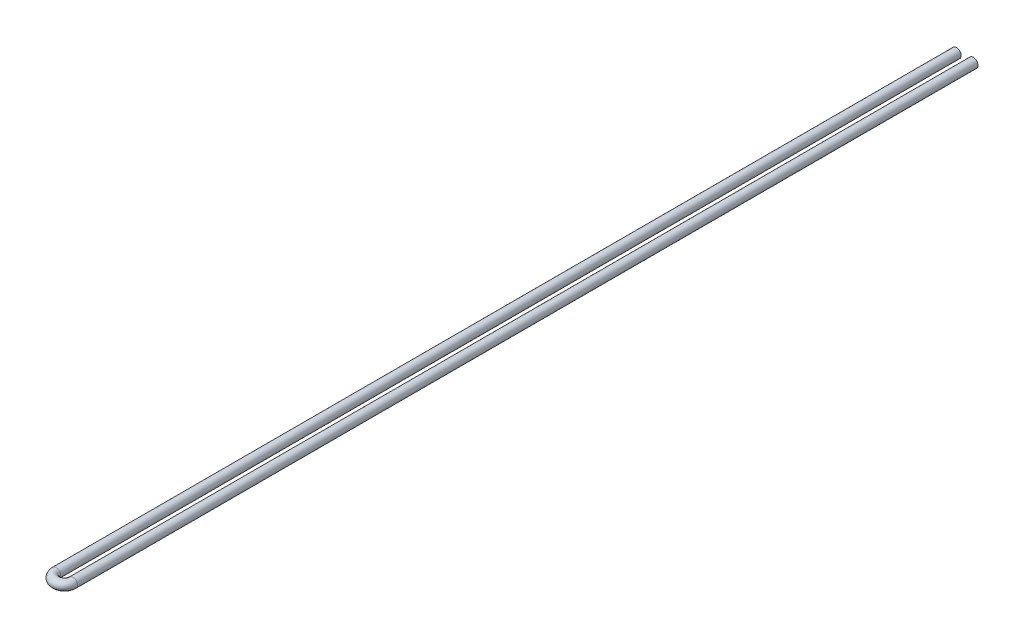
ISO-10303-21;
HEADER;
FILE_DESCRIPTION(('STEP AP214'),'2;1');
FILE_NAME('part.step','',(''),(''),'','','');
FILE_SCHEMA(('AUTOMOTIVE_DESIGN { 1 0 10303 214 1 1 1 1 }'));
ENDSEC;
DATA;
#1=APPLICATION_CONTEXT('core data for automotive mechanical design processes');
#2=APPLICATION_PROTOCOL_DEFINITION('international standard','automotive_design',2000,#1);
#3=PRODUCT_CONTEXT('',#1,'mechanical');
#4=PRODUCT('Part','Part','',(#3));
#5=PRODUCT_RELATED_PRODUCT_CATEGORY('part','',(#4));
#6=PRODUCT_DEFINITION_FORMATION('','',#4);
#7=PRODUCT_DEFINITION_CONTEXT('part definition',#1,'design');
#8=PRODUCT_DEFINITION('design','',#6,#7);
#9=PRODUCT_DEFINITION_SHAPE('','',#8);
#10=(LENGTH_UNIT() NAMED_UNIT(*) SI_UNIT(.MILLI.,.METRE.));
#11=(NAMED_UNIT(*) PLANE_ANGLE_UNIT() SI_UNIT($,.RADIAN.));
#12=(NAMED_UNIT(*) SI_UNIT($,.STERADIAN.) SOLID_ANGLE_UNIT());
#13=UNCERTAINTY_MEASURE_WITH_UNIT(LENGTH_MEASURE(1.E-05),#10,'distance_accuracy_value','');
#14=(GEOMETRIC_REPRESENTATION_CONTEXT(3) GLOBAL_UNCERTAINTY_ASSIGNED_CONTEXT((#13)) GLOBAL_UNIT_ASSIGNED_CONTEXT((#10,
#11,#12)) REPRESENTATION_CONTEXT('',''));
#15=CARTESIAN_POINT('',(0.,0.,0.));
#16=DIRECTION('',(0.,0.,1.));
#17=DIRECTION('',(1.,0.,0.));
#18=AXIS2_PLACEMENT_3D('',#15,#16,#17);
#19=CARTESIAN_POINT('',(-40.,0.,299.999999999999));
#20=DIRECTION('',(0.,0.,1.));
#21=DIRECTION('',(1.,0.,0.));
#22=AXIS2_PLACEMENT_3D('',#19,#20,#21);
#23=CYLINDRICAL_SURFACE('',#22,11.1);
#24=CARTESIAN_POINT('',(-39.9999999999997,0.,2440.));
#25=DIRECTION('',(0.,0.,1.));
#26=DIRECTION('',(1.,0.,0.));
#27=AXIS2_PLACEMENT_3D('',#24,#25,#26);
#28=CIRCLE('',#27,11.1);
#29=CARTESIAN_POINT('',(-51.0999999999997,0.,2440.));
#30=VERTEX_POINT('',#29);
#31=EDGE_CURVE('E52',#30,#30,#28,.T.);
#32=ORIENTED_EDGE('',*,*,#31,.F.);
#33=EDGE_LOOP('',(#32));
#34=FACE_BOUND('',#33,.T.);
#35=CARTESIAN_POINT('',(-40.,0.,299.999999999999));
#36=DIRECTION('',(0.,0.,1.));
#37=DIRECTION('',(1.,0.,0.));
#38=AXIS2_PLACEMENT_3D('',#35,#36,#37);
#39=CIRCLE('',#38,11.1);
#40=CARTESIAN_POINT('',(-28.9,0.,299.999999999999));
#41=VERTEX_POINT('',#40);
#42=EDGE_CURVE('E50',#41,#41,#39,.T.);
#43=ORIENTED_EDGE('',*,*,#42,.T.);
#44=EDGE_LOOP('',(#43));
#45=FACE_BOUND('',#44,.T.);
#46=ADVANCED_FACE('F29',(#34,#45),#23,.T.);
#47=CARTESIAN_POINT('',(-19.9999999999997,0.,2440.));
#48=DIRECTION('',(0.,1.,0.));
#49=DIRECTION('',(0.,0.,1.));
#50=AXIS2_PLACEMENT_3D('',#47,#48,#49);
#51=TOROIDAL_SURFACE('',#50,20.,11.1);
#52=CARTESIAN_POINT('',(3.11658702391645E-13,0.,2440.));
#53=DIRECTION('',(0.,0.,-1.));
#54=DIRECTION('',(-1.,0.,0.));
#55=AXIS2_PLACEMENT_3D('',#52,#53,#54);
#56=CIRCLE('',#55,11.1);
#57=CARTESIAN_POINT('',(11.1000000000003,0.,2440.));
#58=VERTEX_POINT('',#57);
#59=EDGE_CURVE('E33',#58,#58,#56,.T.);
#60=CARTESIAN_POINT('',(-19.9999999999997,0.,2440.));
#61=DIRECTION('',(0.,1.,0.));
#62=DIRECTION('',(0.,0.,1.));
#63=AXIS2_PLACEMENT_3D('',#60,#61,#62);
#64=CIRCLE('',#63,31.1);
#65=EDGE_CURVE('',#30,#58,#64,.T.);
#66=ORIENTED_EDGE('',*,*,#31,.T.);
#67=ORIENTED_EDGE('',*,*,#59,.F.);
#68=ORIENTED_EDGE('',*,*,#65,.T.);
#69=ORIENTED_EDGE('',*,*,#65,.F.);
#70=EDGE_LOOP('',(#66,#68,#67,#69));
#71=FACE_BOUND('',#70,.T.);
#72=ADVANCED_FACE('F60',(#71),#51,.T.);
#73=CARTESIAN_POINT('',(2.75108499923374E-13,0.,2440.));
#74=DIRECTION('',(0.,0.,-1.));
#75=DIRECTION('',(-1.,0.,0.));
#76=AXIS2_PLACEMENT_3D('',#73,#74,#75);
#77=CYLINDRICAL_SURFACE('',#76,11.1);
#78=CARTESIAN_POINT('',(0.,0.,299.999999999999));
#79=DIRECTION('',(0.,0.,-1.));
#80=DIRECTION('',(-1.,0.,0.));
#81=AXIS2_PLACEMENT_3D('',#78,#79,#80);
#82=CIRCLE('',#81,11.1);
#83=CARTESIAN_POINT('',(-11.1,0.,299.999999999999));
#84=VERTEX_POINT('',#83);
#85=EDGE_CURVE('E46',#84,#84,#82,.T.);
#86=ORIENTED_EDGE('',*,*,#85,.F.);
#87=EDGE_LOOP('',(#86));
#88=FACE_BOUND('',#87,.T.);
#89=ORIENTED_EDGE('',*,*,#59,.T.);
#90=EDGE_LOOP('',(#89));
#91=FACE_BOUND('',#90,.T.);
#92=ADVANCED_FACE('F31',(#88,#91),#77,.T.);
#93=CARTESIAN_POINT('',(-40.,0.,299.999999999999));
#94=DIRECTION('',(0.,0.,1.));
#95=DIRECTION('',(1.,0.,0.));
#96=AXIS2_PLACEMENT_3D('',#93,#94,#95);
#97=PLANE('',#96);
#98=CARTESIAN_POINT('',(-40.,0.,299.999999999999));
#99=DIRECTION('',(0.,0.,1.));
#100=DIRECTION('',(1.,0.,0.));
#101=AXIS2_PLACEMENT_3D('',#98,#99,#100);
#102=CIRCLE('',#101,9.95);
#103=CARTESIAN_POINT('',(-30.05,0.,299.999999999999));
#104=VERTEX_POINT('',#103);
#105=EDGE_CURVE('E49',#104,#104,#102,.F.);
#106=ORIENTED_EDGE('',*,*,#105,.F.);
#107=EDGE_LOOP('',(#106));
#108=FACE_BOUND('',#107,.T.);
#109=ORIENTED_EDGE('',*,*,#42,.F.);
#110=EDGE_LOOP('',(#109));
#111=FACE_BOUND('',#110,.T.);
#112=ADVANCED_FACE('F66',(#108,#111),#97,.F.);
#113=CARTESIAN_POINT('',(0.,0.,299.999999999999));
#114=DIRECTION('',(0.,0.,-1.));
#115=DIRECTION('',(-1.,0.,0.));
#116=AXIS2_PLACEMENT_3D('',#113,#114,#115);
#117=PLANE('',#116);
#118=CARTESIAN_POINT('',(0.,0.,299.999999999999));
#119=DIRECTION('',(0.,0.,-1.));
#120=DIRECTION('',(-1.,0.,0.));
#121=AXIS2_PLACEMENT_3D('',#118,#119,#120);
#122=CIRCLE('',#121,9.95);
#123=CARTESIAN_POINT('',(-9.94999999999997,0.,299.999999999999));
#124=VERTEX_POINT('',#123);
#125=EDGE_CURVE('E10',#124,#124,#122,.F.);
#126=ORIENTED_EDGE('',*,*,#125,.T.);
#127=EDGE_LOOP('',(#126));
#128=FACE_BOUND('',#127,.T.);
#129=ORIENTED_EDGE('',*,*,#85,.T.);
#130=EDGE_LOOP('',(#129));
#131=FACE_BOUND('',#130,.T.);
#132=ADVANCED_FACE('F84',(#128,#131),#117,.T.);
#133=CARTESIAN_POINT('',(-40.,0.,299.999999999999));
#134=DIRECTION('',(0.,0.,1.));
#135=DIRECTION('',(1.,0.,0.));
#136=AXIS2_PLACEMENT_3D('',#133,#134,#135);
#137=CYLINDRICAL_SURFACE('',#136,9.95);
#138=CARTESIAN_POINT('',(-39.9999999999997,0.,2440.));
#139=DIRECTION('',(0.,0.,1.));
#140=DIRECTION('',(1.,0.,0.));
#141=AXIS2_PLACEMENT_3D('',#138,#139,#140);
#142=CIRCLE('',#141,9.95);
#143=CARTESIAN_POINT('',(-49.9499999999997,0.,2440.));
#144=VERTEX_POINT('',#143);
#145=EDGE_CURVE('E42',#144,#144,#142,.F.);
#146=ORIENTED_EDGE('',*,*,#145,.F.);
#147=EDGE_LOOP('',(#146));
#148=FACE_BOUND('',#147,.T.);
#149=ORIENTED_EDGE('',*,*,#105,.T.);
#150=EDGE_LOOP('',(#149));
#151=FACE_BOUND('',#150,.T.);
#152=ADVANCED_FACE('F78',(#148,#151),#137,.F.);
#153=CARTESIAN_POINT('',(-19.9999999999997,0.,2440.));
#154=DIRECTION('',(0.,1.,0.));
#155=DIRECTION('',(0.,0.,1.));
#156=AXIS2_PLACEMENT_3D('',#153,#154,#155);
#157=TOROIDAL_SURFACE('',#156,20.,9.95);
#158=CARTESIAN_POINT('',(3.11658702391645E-13,0.,2440.));
#159=DIRECTION('',(0.,0.,-1.));
#160=DIRECTION('',(-1.,0.,0.));
#161=AXIS2_PLACEMENT_3D('',#158,#159,#160);
#162=CIRCLE('',#161,9.95);
#163=CARTESIAN_POINT('',(9.95000000000028,0.,2440.));
#164=VERTEX_POINT('',#163);
#165=EDGE_CURVE('E37',#164,#164,#162,.F.);
#166=CARTESIAN_POINT('',(-19.9999999999997,0.,2440.));
#167=DIRECTION('',(0.,1.,0.));
#168=DIRECTION('',(0.,0.,1.));
#169=AXIS2_PLACEMENT_3D('',#166,#167,#168);
#170=CIRCLE('',#169,29.95);
#171=EDGE_CURVE('',#144,#164,#170,.T.);
#172=ORIENTED_EDGE('',*,*,#145,.T.);
#173=ORIENTED_EDGE('',*,*,#165,.F.);
#174=ORIENTED_EDGE('',*,*,#171,.T.);
#175=ORIENTED_EDGE('',*,*,#171,.F.);
#176=EDGE_LOOP('',(#172,#174,#173,#175));
#177=FACE_BOUND('',#176,.T.);
#178=ADVANCED_FACE('F72',(#177),#157,.F.);
#179=CARTESIAN_POINT('',(2.75108499923374E-13,0.,2440.));
#180=DIRECTION('',(0.,0.,-1.));
#181=DIRECTION('',(-1.,0.,0.));
#182=AXIS2_PLACEMENT_3D('',#179,#180,#181);
#183=CYLINDRICAL_SURFACE('',#182,9.95);
#184=ORIENTED_EDGE('',*,*,#125,.F.);
#185=EDGE_LOOP('',(#184));
#186=FACE_BOUND('',#185,.T.);
#187=ORIENTED_EDGE('',*,*,#165,.T.);
#188=EDGE_LOOP('',(#187));
#189=FACE_BOUND('',#188,.T.);
#190=ADVANCED_FACE('F70',(#186,#189),#183,.F.);
#191=CLOSED_SHELL('',(#46,#72,#92,#112,#132,#152,#178,#190));
#192=MANIFOLD_SOLID_BREP('B2',#191);
#193=ADVANCED_BREP_SHAPE_REPRESENTATION('',(#18,#192),#14);
#194=SHAPE_DEFINITION_REPRESENTATION(#9,#193);
ENDSEC;
END-ISO-10303-21;
